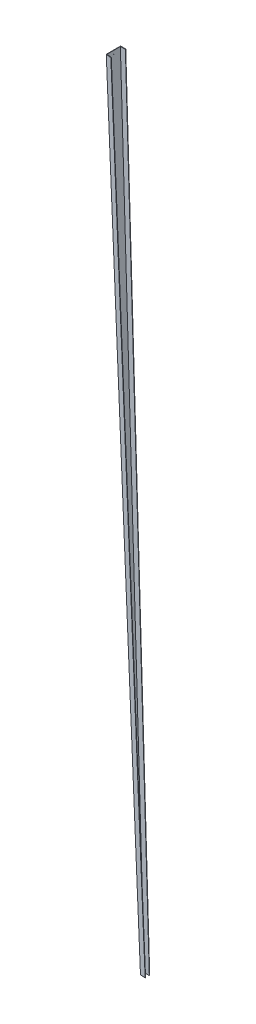
ISO-10303-21;
HEADER;
FILE_DESCRIPTION(('STEP AP214'),'2;1');
FILE_NAME('part.step','',(''),(''),'','','');
FILE_SCHEMA(('AUTOMOTIVE_DESIGN { 1 0 10303 214 1 1 1 1 }'));
ENDSEC;
DATA;
#1=APPLICATION_CONTEXT('core data for automotive mechanical design processes');
#2=APPLICATION_PROTOCOL_DEFINITION('international standard','automotive_design',2000,#1);
#3=PRODUCT_CONTEXT('',#1,'mechanical');
#4=PRODUCT('Part','Part','',(#3));
#5=PRODUCT_RELATED_PRODUCT_CATEGORY('part','',(#4));
#6=PRODUCT_DEFINITION_FORMATION('','',#4);
#7=PRODUCT_DEFINITION_CONTEXT('part definition',#1,'design');
#8=PRODUCT_DEFINITION('design','',#6,#7);
#9=PRODUCT_DEFINITION_SHAPE('','',#8);
#10=(LENGTH_UNIT() NAMED_UNIT(*) SI_UNIT(.MILLI.,.METRE.));
#11=(NAMED_UNIT(*) PLANE_ANGLE_UNIT() SI_UNIT($,.RADIAN.));
#12=(NAMED_UNIT(*) SI_UNIT($,.STERADIAN.) SOLID_ANGLE_UNIT());
#13=UNCERTAINTY_MEASURE_WITH_UNIT(LENGTH_MEASURE(1.E-05),#10,'distance_accuracy_value','');
#14=(GEOMETRIC_REPRESENTATION_CONTEXT(3) GLOBAL_UNCERTAINTY_ASSIGNED_CONTEXT((#13)) GLOBAL_UNIT_ASSIGNED_CONTEXT((#10,
#11,#12)) REPRESENTATION_CONTEXT('',''));
#15=CARTESIAN_POINT('',(0.,0.,0.));
#16=DIRECTION('',(0.,0.,1.));
#17=DIRECTION('',(1.,0.,0.));
#18=AXIS2_PLACEMENT_3D('',#15,#16,#17);
#19=CARTESIAN_POINT('',(602.457169605204,27.6347282334182,6.30826057862492E-12));
#20=DIRECTION('',(-0.998949627434447,-0.0458218490305554,0.));
#21=DIRECTION('',(0.0458218490305554,-0.998949627434447,0.));
#22=AXIS2_PLACEMENT_3D('',#19,#20,#21);
#23=PLANE('',#22);
#24=CARTESIAN_POINT('',(606.749301326457,-65.9368642395666,48.7060166163307));
#25=DIRECTION('',(0.998949627434447,0.0458218490305554,0.));
#26=DIRECTION('',(-0.0458218490305554,0.998949627434447,0.));
#27=AXIS2_PLACEMENT_3D('',#24,#25,#26);
#28=CIRCLE('',#27,1.99999999999999);
#29=CARTESIAN_POINT('',(606.657657628396,-63.9389649846978,48.7060166163307));
#30=VERTEX_POINT('',#29);
#31=EDGE_CURVE('E406',#30,#30,#28,.T.);
#32=ORIENTED_EDGE('',*,*,#31,.F.);
#33=EDGE_LOOP('',(#32));
#34=FACE_BOUND('',#33,.T.);
#35=CARTESIAN_POINT('',(606.749301326457,-65.9368642395666,8.70601661633069));
#36=DIRECTION('',(0.998949627434447,0.0458218490305554,0.));
#37=DIRECTION('',(-0.0458218490305554,0.998949627434447,0.));
#38=AXIS2_PLACEMENT_3D('',#35,#36,#37);
#39=CIRCLE('',#38,1.99999999999999);
#40=CARTESIAN_POINT('',(606.657657628396,-63.9389649846977,8.70601661633069));
#41=VERTEX_POINT('',#40);
#42=EDGE_CURVE('E390',#41,#41,#39,.T.);
#43=ORIENTED_EDGE('',*,*,#42,.F.);
#44=EDGE_LOOP('',(#43));
#45=FACE_BOUND('',#44,.T.);
#46=CARTESIAN_POINT('',(606.749301326458,-65.9368642395666,-31.2939833836693));
#47=DIRECTION('',(0.998949627434447,0.0458218490305554,0.));
#48=DIRECTION('',(-0.0458218490305554,0.998949627434447,0.));
#49=AXIS2_PLACEMENT_3D('',#46,#47,#48);
#50=CIRCLE('',#49,1.99999999999999);
#51=CARTESIAN_POINT('',(606.657657628396,-63.9389649846977,-31.2939833836693));
#52=VERTEX_POINT('',#51);
#53=EDGE_CURVE('E386',#52,#52,#50,.T.);
#54=ORIENTED_EDGE('',*,*,#53,.F.);
#55=EDGE_LOOP('',(#54));
#56=FACE_BOUND('',#55,.T.);
#57=DIRECTION('',(0.0458217623312295,-0.998947737326102,0.00194529892876554));
#58=VECTOR('',#57,1.);
#59=CARTESIAN_POINT('',(603.999995586582,-6.,178.649131077976));
#60=LINE('',#59,#58);
#61=CARTESIAN_POINT('',(603.999995586582,-6.,178.649131077976));
#62=VERTEX_POINT('',#61);
#63=CARTESIAN_POINT('',(1291.5,-14994.,207.835983657852));
#64=VERTEX_POINT('',#63);
#65=EDGE_CURVE('E234',#62,#64,#60,.T.);
#66=ORIENTED_EDGE('',*,*,#65,.T.);
#67=DIRECTION('',(0.,0.,1.));
#68=VECTOR('',#67,1.);
#69=CARTESIAN_POINT('',(1291.5,-14994.,1.35231497745026E-11));
#70=LINE('',#69,#68);
#71=CARTESIAN_POINT('',(1291.5,-14994.,144.218273573466));
#72=VERTEX_POINT('',#71);
#73=EDGE_CURVE('E197',#72,#64,#70,.T.);
#74=ORIENTED_EDGE('',*,*,#73,.F.);
#75=DIRECTION('',(0.0458166659402589,-0.998836632297189,0.0150404489071898));
#76=VECTOR('',#75,1.);
#77=CARTESIAN_POINT('',(603.999995586582,-6.,-81.4705337167815));
#78=LINE('',#77,#76);
#79=CARTESIAN_POINT('',(603.999995586583,-5.99999999999997,-81.4705337167815));
#80=VERTEX_POINT('',#79);
#81=EDGE_CURVE('E231',#80,#72,#78,.T.);
#82=ORIENTED_EDGE('',*,*,#81,.F.);
#83=DIRECTION('',(0.,0.,1.));
#84=VECTOR('',#83,1.);
#85=CARTESIAN_POINT('',(603.999995586584,-5.99999999999991,6.30826057862492E-12));
#86=LINE('',#85,#84);
#87=EDGE_CURVE('E525',#80,#62,#86,.T.);
#88=ORIENTED_EDGE('',*,*,#87,.T.);
#89=EDGE_LOOP('',(#66,#74,#82,#88));
#90=FACE_BOUND('',#89,.T.);
#91=CARTESIAN_POINT('',(606.749301326456,-65.9368642395666,128.706016616331));
#92=DIRECTION('',(0.998949627434447,0.0458218490305554,0.));
#93=DIRECTION('',(-0.0458218490305554,0.998949627434447,0.));
#94=AXIS2_PLACEMENT_3D('',#91,#92,#93);
#95=CIRCLE('',#94,1.99999999999997);
#96=CARTESIAN_POINT('',(606.657657628395,-63.9389649846977,128.706016616331));
#97=VERTEX_POINT('',#96);
#98=EDGE_CURVE('E393',#97,#97,#95,.T.);
#99=ORIENTED_EDGE('',*,*,#98,.F.);
#100=EDGE_LOOP('',(#99));
#101=FACE_BOUND('',#100,.T.);
#102=CARTESIAN_POINT('',(606.749301326456,-65.9368642395666,88.7060166163307));
#103=DIRECTION('',(0.998949627434447,0.0458218490305554,0.));
#104=DIRECTION('',(-0.0458218490305554,0.998949627434447,0.));
#105=AXIS2_PLACEMENT_3D('',#102,#103,#104);
#106=CIRCLE('',#105,1.99999999999999);
#107=CARTESIAN_POINT('',(606.657657628395,-63.9389649846977,88.7060166163307));
#108=VERTEX_POINT('',#107);
#109=EDGE_CURVE('E396',#108,#108,#106,.T.);
#110=ORIENTED_EDGE('',*,*,#109,.F.);
#111=EDGE_LOOP('',(#110));
#112=FACE_BOUND('',#111,.T.);
#113=ADVANCED_FACE('F83',(#34,#45,#56,#90,#101,#112),#23,.F.);
#114=CARTESIAN_POINT('',(600.,-6.,-89.4645917201508));
#115=CARTESIAN_POINT('',(602.959954579327,-6.,-89.4845653543023));
#116=CARTESIAN_POINT('',(672.159470052555,-6.,-89.915884825626));
#117=CARTESIAN_POINT('',(807.50010751329,-6.,-89.1942007030712));
#118=CARTESIAN_POINT('',(1005.86522896463,-6.,-85.7827057176364));
#119=CARTESIAN_POINT('',(1269.9834249324,-6.,-79.4685170125723));
#120=CARTESIAN_POINT('',(1600.82582994271,-6.,-70.8683714694671));
#121=CARTESIAN_POINT('',(1998.59898384505,-6.,-59.7433814067206));
#122=CARTESIAN_POINT('',(2331.90774460236,-6.,-48.6742990694277));
#123=CARTESIAN_POINT('',(2532.42608256137,-6.,-42.1441188913942));
#124=CARTESIAN_POINT('',(2599.99999999987,-6.,-39.9640819582946));
#125=B_SPLINE_CURVE_WITH_KNOTS('',3,(#114,#115,#116,#117,#118,#119,#120,#121,#122,#123,#124),
.UNSPECIFIED.,.F.,.F.,(4,1,1,1,1,1,1,1,4),(0.579110380304753,0.580209466371041,
0.604805069213507,0.629344388861473,0.653862178346251,0.702881350286838,0.752206113639191,
0.801585908260931,0.826684648113737),.UNSPECIFIED.);
#126=DIRECTION('',(0.,1.,0.));
#127=VECTOR('',#126,1.);
#128=SURFACE_OF_LINEAR_EXTRUSION('',#125,#127);
#129=CARTESIAN_POINT('',(600.,0.,-89.4645917201508));
#130=CARTESIAN_POINT('',(602.959954579327,0.,-89.4845653543023));
#131=CARTESIAN_POINT('',(672.159470052555,0.,-89.915884825626));
#132=CARTESIAN_POINT('',(807.50010751329,0.,-89.1942007030712));
#133=CARTESIAN_POINT('',(1005.86522896463,0.,-85.7827057176364));
#134=CARTESIAN_POINT('',(1269.9834249324,0.,-79.4685170125723));
#135=CARTESIAN_POINT('',(1600.82582994271,0.,-70.8683714694671));
#136=CARTESIAN_POINT('',(1998.59898384505,0.,-59.7433814067206));
#137=CARTESIAN_POINT('',(2331.90774460236,0.,-48.6742990694277));
#138=CARTESIAN_POINT('',(2532.42608256137,0.,-42.1441188913942));
#139=CARTESIAN_POINT('',(2599.99999999987,0.,-39.9640819582946));
#140=B_SPLINE_CURVE_WITH_KNOTS('',3,(#129,#130,#131,#132,#133,#134,#135,#136,#137,#138,#139),
.UNSPECIFIED.,.F.,.F.,(4,1,1,1,1,1,1,1,4),(0.579110380304753,0.580209466371041,
0.604805069213507,0.629344388861473,0.653862178346251,0.702881350286838,0.752206113639191,
0.801585908260931,0.826684648113737),.UNSPECIFIED.);
#141=CARTESIAN_POINT('',(600.,0.,-89.4645917201508));
#142=VERTEX_POINT('',#141);
#143=CARTESIAN_POINT('',(700.,0.,-89.6130576844665));
#144=VERTEX_POINT('',#143);
#145=EDGE_CURVE('E299',#142,#144,#140,.T.);
#146=ORIENTED_EDGE('',*,*,#145,.T.);
#147=DIRECTION('',(0.,1.,0.));
#148=VECTOR('',#147,1.);
#149=CARTESIAN_POINT('',(700.,-6.,-89.6130576844665));
#150=LINE('',#149,#148);
#151=CARTESIAN_POINT('',(700.,-6.,-89.6130576844665));
#152=VERTEX_POINT('',#151);
#153=EDGE_CURVE('E12',#152,#144,#150,.T.);
#154=ORIENTED_EDGE('',*,*,#153,.F.);
#155=CARTESIAN_POINT('',(600.,-6.,-89.4645917201508));
#156=CARTESIAN_POINT('',(602.959954579327,-6.,-89.4845653543023));
#157=CARTESIAN_POINT('',(619.624334203692,-6.,-89.5884341655268));
#158=CARTESIAN_POINT('',(636.290291408736,-6.,-89.6458822146248));
#159=CARTESIAN_POINT('',(666.663572408395,-6.,-89.687677717433));
#160=CARTESIAN_POINT('',(683.331529465492,-6.,-89.6686443909208));
#161=CARTESIAN_POINT('',(700.,-6.,-89.6130576844665));
#162=B_SPLINE_CURVE_WITH_KNOTS('',3,(#155,#156,#157,#158,#159,#160,#161),.UNSPECIFIED.,.F.,.F.,
(4,1,2,4),(0.,0.0888121217356998,0.5,1.),.UNSPECIFIED.);
#163=CARTESIAN_POINT('',(600.,-6.,-89.4645917201508));
#164=VERTEX_POINT('',#163);
#165=EDGE_CURVE('E161',#164,#152,#162,.T.);
#166=ORIENTED_EDGE('',*,*,#165,.F.);
#167=DIRECTION('',(0.,1.,0.));
#168=VECTOR('',#167,1.);
#169=CARTESIAN_POINT('',(600.,-6.,-89.4645917201508));
#170=LINE('',#169,#168);
#171=EDGE_CURVE('E838',#164,#142,#170,.T.);
#172=ORIENTED_EDGE('',*,*,#171,.T.);
#173=EDGE_LOOP('',(#146,#154,#166,#172));
#174=FACE_BOUND('',#173,.T.);
#175=ADVANCED_FACE('F85',(#174),#128,.F.);
#176=CARTESIAN_POINT('',(699.693373253527,-6.,2.33336646375407));
#177=DIRECTION('',(-0.99999443946263,0.,-0.0033348229069724));
#178=DIRECTION('',(-0.0033348229069724,0.,0.99999443946263));
#179=AXIS2_PLACEMENT_3D('',#176,#177,#178);
#180=PLANE('',#179);
#181=DIRECTION('',(-0.0033348229069724,0.,0.99999443946263));
#182=VECTOR('',#181,1.);
#183=CARTESIAN_POINT('',(699.693373253527,0.,2.33336646375407));
#184=LINE('',#183,#182);
#185=CARTESIAN_POINT('',(699.973321416744,0.,-81.6131021687654));
#186=VERTEX_POINT('',#185);
#187=EDGE_CURVE('E908',#144,#186,#184,.T.);
#188=ORIENTED_EDGE('',*,*,#187,.T.);
#189=DIRECTION('',(0.,1.,0.));
#190=VECTOR('',#189,1.);
#191=CARTESIAN_POINT('',(699.973321416744,-6.,-81.6131021687654));
#192=LINE('',#191,#190);
#193=CARTESIAN_POINT('',(699.973321416747,-6.00000000013778,-81.6131021687644));
#194=VERTEX_POINT('',#193);
#195=EDGE_CURVE('E95',#194,#186,#192,.T.);
#196=ORIENTED_EDGE('',*,*,#195,.F.);
#197=DIRECTION('',(-0.0033348229069724,0.,0.99999443946263));
#198=VECTOR('',#197,1.);
#199=CARTESIAN_POINT('',(699.693373253527,-6.,2.33336646375407));
#200=LINE('',#199,#198);
#201=EDGE_CURVE('E153',#152,#194,#200,.T.);
#202=ORIENTED_EDGE('',*,*,#201,.F.);
#203=ORIENTED_EDGE('',*,*,#153,.T.);
#204=EDGE_LOOP('',(#188,#196,#202,#203));
#205=FACE_BOUND('',#204,.T.);
#206=ADVANCED_FACE('F510',(#205),#180,.F.);
#207=CARTESIAN_POINT('',(-0.119691424209446,-6.,-80.5731134404165));
#208=DIRECTION('',(0.00148549915767978,0.,0.999998896645518));
#209=DIRECTION('',(0.999998896645518,0.,-0.00148549915767978));
#210=AXIS2_PLACEMENT_3D('',#207,#208,#209);
#211=PLANE('',#210);
#212=DIRECTION('',(0.999998896645518,0.,-0.00148549915767978));
#213=VECTOR('',#212,1.);
#214=CARTESIAN_POINT('',(-0.119691424209446,0.,-80.5731134404165));
#215=LINE('',#214,#213);
#216=CARTESIAN_POINT('',(603.999995586582,0.,-81.4705337167815));
#217=VERTEX_POINT('',#216);
#218=EDGE_CURVE('E905',#217,#186,#215,.T.);
#219=ORIENTED_EDGE('',*,*,#218,.F.);
#220=DIRECTION('',(0.,1.,0.));
#221=VECTOR('',#220,1.);
#222=CARTESIAN_POINT('',(603.999995586582,-6.,-81.4705337167815));
#223=LINE('',#222,#221);
#224=EDGE_CURVE('E932',#80,#217,#223,.T.);
#225=ORIENTED_EDGE('',*,*,#224,.F.);
#226=DIRECTION('',(0.999998896645518,0.,-0.00148549915767978));
#227=VECTOR('',#226,1.);
#228=CARTESIAN_POINT('',(-0.119691424209446,-6.,-80.5731134404165));
#229=LINE('',#228,#227);
#230=EDGE_CURVE('E145',#80,#194,#229,.T.);
#231=ORIENTED_EDGE('',*,*,#230,.T.);
#232=ORIENTED_EDGE('',*,*,#195,.T.);
#233=EDGE_LOOP('',(#219,#225,#231,#232));
#234=FACE_BOUND('',#233,.T.);
#235=ADVANCED_FACE('F955',(#234),#211,.T.);
#236=CARTESIAN_POINT('',(603.999995586582,-6.,0.));
#237=DIRECTION('',(-1.,0.,0.));
#238=DIRECTION('',(0.,0.,1.));
#239=AXIS2_PLACEMENT_3D('',#236,#237,#238);
#240=PLANE('',#239);
#241=DIRECTION('',(0.,0.,1.));
#242=VECTOR('',#241,1.);
#243=CARTESIAN_POINT('',(603.999995586582,0.,0.));
#244=LINE('',#243,#242);
#245=CARTESIAN_POINT('',(603.999995586582,0.,178.649131077976));
#246=VERTEX_POINT('',#245);
#247=EDGE_CURVE('E903',#217,#246,#244,.T.);
#248=ORIENTED_EDGE('',*,*,#247,.T.);
#249=DIRECTION('',(0.,1.,0.));
#250=VECTOR('',#249,1.);
#251=CARTESIAN_POINT('',(603.999995586582,-6.,178.649131077976));
#252=LINE('',#251,#250);
#253=EDGE_CURVE('E934',#62,#246,#252,.T.);
#254=ORIENTED_EDGE('',*,*,#253,.F.);
#255=ORIENTED_EDGE('',*,*,#87,.F.);
#256=ORIENTED_EDGE('',*,*,#224,.T.);
#257=EDGE_LOOP('',(#248,#254,#255,#256));
#258=FACE_BOUND('',#257,.T.);
#259=ADVANCED_FACE('F970',(#258),#240,.F.);
#260=CARTESIAN_POINT('',(-12.4360773083858,-6.,107.011604593883));
#261=DIRECTION('',(-0.115435534804312,0.,0.993314973865008));
#262=DIRECTION('',(0.993314973865009,0.,0.115435534804312));
#263=AXIS2_PLACEMENT_3D('',#260,#261,#262);
#264=PLANE('',#263);
#265=DIRECTION('',(0.993314973865009,0.,0.115435534804312));
#266=VECTOR('',#265,1.);
#267=CARTESIAN_POINT('',(-12.4360773083858,0.,107.011604593883));
#268=LINE('',#267,#266);
#269=CARTESIAN_POINT('',(700.169555672472,0.,189.825228179597));
#270=VERTEX_POINT('',#269);
#271=EDGE_CURVE('E900',#246,#270,#268,.T.);
#272=ORIENTED_EDGE('',*,*,#271,.T.);
#273=DIRECTION('',(0.,1.,0.));
#274=VECTOR('',#273,1.);
#275=CARTESIAN_POINT('',(700.169555672472,-6.,189.825228179597));
#276=LINE('',#275,#274);
#277=CARTESIAN_POINT('',(700.169555672472,-6.00000000001838,189.825228179598));
#278=VERTEX_POINT('',#277);
#279=EDGE_CURVE('E937',#278,#270,#276,.T.);
#280=ORIENTED_EDGE('',*,*,#279,.F.);
#281=DIRECTION('',(0.993314973865009,0.,0.115435534804312));
#282=VECTOR('',#281,1.);
#283=CARTESIAN_POINT('',(-12.4360773083858,-6.,107.011604593883));
#284=LINE('',#283,#282);
#285=EDGE_CURVE('E230',#62,#278,#284,.T.);
#286=ORIENTED_EDGE('',*,*,#285,.F.);
#287=ORIENTED_EDGE('',*,*,#253,.T.);
#288=EDGE_LOOP('',(#272,#280,#286,#287));
#289=FACE_BOUND('',#288,.T.);
#290=ADVANCED_FACE('F949',(#289),#264,.F.);
#291=CARTESIAN_POINT('',(712.292264494189,-6.,75.5866575821689));
#292=DIRECTION('',(0.994416651818414,0.,0.105524985601775));
#293=DIRECTION('',(0.105524985601775,0.,-0.994416651818414));
#294=AXIS2_PLACEMENT_3D('',#291,#292,#293);
#295=PLANE('',#294);
#296=DIRECTION('',(0.105524985601775,0.,-0.994416651818414));
#297=VECTOR('',#296,1.);
#298=CARTESIAN_POINT('',(712.292264494189,0.,75.5866575821689));
#299=LINE('',#298,#297);
#300=CARTESIAN_POINT('',(699.325355787658,0.,197.780561394145));
#301=VERTEX_POINT('',#300);
#302=EDGE_CURVE('E894',#301,#270,#299,.T.);
#303=ORIENTED_EDGE('',*,*,#302,.F.);
#304=DIRECTION('',(0.,1.,0.));
#305=VECTOR('',#304,1.);
#306=CARTESIAN_POINT('',(699.325355787658,-6.,197.780561394145));
#307=LINE('',#306,#305);
#308=CARTESIAN_POINT('',(699.325355787658,-6.,197.780561394145));
#309=VERTEX_POINT('',#308);
#310=EDGE_CURVE('E913',#309,#301,#307,.T.);
#311=ORIENTED_EDGE('',*,*,#310,.F.);
#312=DIRECTION('',(0.105524985601775,0.,-0.994416651818414));
#313=VECTOR('',#312,1.);
#314=CARTESIAN_POINT('',(712.292264494189,-6.,75.5866575821689));
#315=LINE('',#314,#313);
#316=EDGE_CURVE('E842',#309,#278,#315,.T.);
#317=ORIENTED_EDGE('',*,*,#316,.T.);
#318=ORIENTED_EDGE('',*,*,#279,.T.);
#319=EDGE_LOOP('',(#303,#311,#317,#318));
#320=FACE_BOUND('',#319,.T.);
#321=ADVANCED_FACE('F866',(#320),#295,.T.);
#322=CARTESIAN_POINT('',(2599.99999999987,-6.,170.586846022276));
#323=CARTESIAN_POINT('',(2534.26970415841,-6.,176.346832185852));
#324=CARTESIAN_POINT('',(2334.95316219608,-6.,192.748822912609));
#325=CARTESIAN_POINT('',(2001.69070185449,-6.,214.463612082598));
#326=CARTESIAN_POINT('',(1599.37094291801,-6.,231.35256071879));
#327=CARTESIAN_POINT('',(1263.24435450254,-6.,232.556224403624));
#328=CARTESIAN_POINT('',(993.973907448511,-6.,222.123757286777));
#329=CARTESIAN_POINT('',(795.174235255832,-6.,208.219874455327));
#330=CARTESIAN_POINT('',(663.965855096807,-6.,194.360823911171));
#331=CARTESIAN_POINT('',(600.,-6.,186.18428191945));
#332=B_SPLINE_CURVE_WITH_KNOTS('',3,(#322,#323,#324,#325,#326,#327,#328,#329,#330,#331),
.UNSPECIFIED.,.F.,.F.,(4,1,1,1,1,1,1,4),(0.174597883745963,0.199092181037773,0.248838608700846,
0.298568063520415,0.348560819140765,0.373566506187247,0.398590699494546,0.422530238981496),.UNSPECIFIED.);
#333=DIRECTION('',(0.,1.,0.));
#334=VECTOR('',#333,1.);
#335=SURFACE_OF_LINEAR_EXTRUSION('',#332,#334);
#336=CARTESIAN_POINT('',(2599.99999999987,0.,170.586846022276));
#337=CARTESIAN_POINT('',(2534.26970415841,0.,176.346832185852));
#338=CARTESIAN_POINT('',(2334.95316219608,0.,192.748822912609));
#339=CARTESIAN_POINT('',(2001.69070185449,0.,214.463612082598));
#340=CARTESIAN_POINT('',(1599.37094291801,0.,231.35256071879));
#341=CARTESIAN_POINT('',(1263.24435450254,0.,232.556224403624));
#342=CARTESIAN_POINT('',(993.973907448511,0.,222.123757286777));
#343=CARTESIAN_POINT('',(795.174235255832,0.,208.219874455327));
#344=CARTESIAN_POINT('',(663.965855096807,0.,194.360823911171));
#345=CARTESIAN_POINT('',(600.,0.,186.18428191945));
#346=B_SPLINE_CURVE_WITH_KNOTS('',3,(#336,#337,#338,#339,#340,#341,#342,#343,#344,#345),
.UNSPECIFIED.,.F.,.F.,(4,1,1,1,1,1,1,4),(0.174597883745963,0.199092181037773,0.248838608700846,
0.298568063520415,0.348560819140765,0.373566506187247,0.398590699494546,0.422530238981496),.UNSPECIFIED.);
#347=CARTESIAN_POINT('',(600.,0.,186.18428191945));
#348=VERTEX_POINT('',#347);
#349=EDGE_CURVE('E889',#301,#348,#346,.T.);
#350=ORIENTED_EDGE('',*,*,#349,.T.);
#351=DIRECTION('',(0.,1.,0.));
#352=VECTOR('',#351,1.);
#353=CARTESIAN_POINT('',(600.,-6.,186.18428191945));
#354=LINE('',#353,#352);
#355=CARTESIAN_POINT('',(600.,-6.,186.18428191945));
#356=VERTEX_POINT('',#355);
#357=EDGE_CURVE('E911',#356,#348,#354,.T.);
#358=ORIENTED_EDGE('',*,*,#357,.F.);
#359=CARTESIAN_POINT('',(699.325355787657,-6.,197.780561394145));
#360=CARTESIAN_POINT('',(682.750677507029,-6.,196.021698362518));
#361=CARTESIAN_POINT('',(666.185158089687,-6.,194.179220645661));
#362=CARTESIAN_POINT('',(633.075638865744,-6.,190.317104575944));
#363=CARTESIAN_POINT('',(616.531639059144,-6.,188.297466223084));
#364=CARTESIAN_POINT('',(600.,-6.,186.18428191945));
#365=B_SPLINE_CURVE_WITH_KNOTS('',3,(#359,#360,#361,#362,#363,#364),.UNSPECIFIED.,.F.,.F.,(4,2,
4),(0.,0.5,1.),.UNSPECIFIED.);
#366=EDGE_CURVE('E247',#309,#356,#365,.T.);
#367=ORIENTED_EDGE('',*,*,#366,.F.);
#368=ORIENTED_EDGE('',*,*,#310,.T.);
#369=EDGE_LOOP('',(#350,#358,#367,#368));
#370=FACE_BOUND('',#369,.T.);
#371=ADVANCED_FACE('F855',(#370),#335,.F.);
#372=CARTESIAN_POINT('',(600.,-6.,0.));
#373=DIRECTION('',(-1.,0.,0.));
#374=DIRECTION('',(0.,0.,1.));
#375=AXIS2_PLACEMENT_3D('',#372,#373,#374);
#376=PLANE('',#375);
#377=DIRECTION('',(0.,0.,1.));
#378=VECTOR('',#377,1.);
#379=CARTESIAN_POINT('',(600.,0.,0.));
#380=LINE('',#379,#378);
#381=EDGE_CURVE('E883',#142,#348,#380,.T.);
#382=ORIENTED_EDGE('',*,*,#381,.F.);
#383=ORIENTED_EDGE('',*,*,#171,.F.);
#384=DIRECTION('',(0.,0.,1.));
#385=VECTOR('',#384,1.);
#386=CARTESIAN_POINT('',(600.,-6.,0.));
#387=LINE('',#386,#385);
#388=EDGE_CURVE('E755',#164,#356,#387,.T.);
#389=ORIENTED_EDGE('',*,*,#388,.T.);
#390=ORIENTED_EDGE('',*,*,#357,.T.);
#391=EDGE_LOOP('',(#382,#383,#389,#390));
#392=FACE_BOUND('',#391,.T.);
#393=ADVANCED_FACE('F865',(#392),#376,.T.);
#394=CARTESIAN_POINT('',(0.,0.,0.));
#395=DIRECTION('',(0.,1.,0.));
#396=DIRECTION('',(0.,0.,1.));
#397=AXIS2_PLACEMENT_3D('',#394,#395,#396);
#398=PLANE('',#397);
#399=ORIENTED_EDGE('',*,*,#145,.F.);
#400=ORIENTED_EDGE('',*,*,#381,.T.);
#401=ORIENTED_EDGE('',*,*,#349,.F.);
#402=ORIENTED_EDGE('',*,*,#302,.T.);
#403=ORIENTED_EDGE('',*,*,#271,.F.);
#404=ORIENTED_EDGE('',*,*,#247,.F.);
#405=ORIENTED_EDGE('',*,*,#218,.T.);
#406=ORIENTED_EDGE('',*,*,#187,.F.);
#407=EDGE_LOOP('',(#399,#400,#401,#402,#403,#404,#405,#406));
#408=FACE_BOUND('',#407,.T.);
#409=ADVANCED_FACE('F597',(#408),#398,.T.);
#410=CARTESIAN_POINT('',(699.973321416744,-6.,-81.6131021687655));
#411=CARTESIAN_POINT('',(1387.36019350182,-14994.,144.900282567612));
#412=CARTESIAN_POINT('',(683.977767111713,-6.,-81.5893407601015));
#413=CARTESIAN_POINT('',(1371.38349458484,-14994.,144.786614401921));
#414=CARTESIAN_POINT('',(667.982212806683,-6.,-81.5655793514374));
#415=CARTESIAN_POINT('',(1355.40679566786,-14994.,144.67294623623));
#416=CARTESIAN_POINT('',(635.991104196629,-6.,-81.5180565341095));
#417=CARTESIAN_POINT('',(1323.45339783392,-14994.,144.445609904848));
#418=CARTESIAN_POINT('',(619.995549891605,-6.,-81.4942951254455));
#419=CARTESIAN_POINT('',(1307.47669891696,-14994.,144.331941739157));
#420=CARTESIAN_POINT('',(603.999995586582,-6.,-81.4705337167815));
#421=CARTESIAN_POINT('',(1291.5,-14994.,144.218273573466));
#422=B_SPLINE_SURFACE_WITH_KNOTS('',3,1,((#410,#411),(#412,#413),(#414,#415),(#416,#417),(#418,
#419),(#420,#421)),.UNSPECIFIED.,.F.,.F.,.F.,(4,2,4),(2,2),(0.,0.5,1.),(0.,1.),.UNSPECIFIED.);
#423=DIRECTION('',(0.999974692041193,0.,0.00711444144829202));
#424=VECTOR('',#423,1.);
#425=CARTESIAN_POINT('',(-0.960636865922877,-14994.,135.022905332261));
#426=LINE('',#425,#424);
#427=CARTESIAN_POINT('',(1387.36019350182,-14994.,144.900282567612));
#428=VERTEX_POINT('',#427);
#429=EDGE_CURVE('E324',#72,#428,#426,.T.);
#430=DIRECTION('',(0.0458091044199773,-0.998836150251133,0.0150953934607978));
#431=VECTOR('',#430,1.);
#432=CARTESIAN_POINT('',(1043.66675745928,-7500.,31.6435901994234));
#433=LINE('',#432,#431);
#434=EDGE_CURVE('E533',#194,#428,#433,.T.);
#435=ORIENTED_EDGE('',*,*,#230,.F.);
#436=ORIENTED_EDGE('',*,*,#81,.T.);
#437=ORIENTED_EDGE('',*,*,#429,.T.);
#438=ORIENTED_EDGE('',*,*,#434,.F.);
#439=EDGE_LOOP('',(#435,#436,#437,#438));
#440=FACE_BOUND('',#439,.T.);
#441=ADVANCED_FACE('F587',(#440),#422,.T.);
#442=CARTESIAN_POINT('',(603.999995586582,-6.,178.649131077976));
#443=CARTESIAN_POINT('',(1291.5,-14994.,207.835983657852));
#444=CARTESIAN_POINT('',(620.028255600897,-6.,180.511813928246));
#445=CARTESIAN_POINT('',(1307.51271827648,-14994.,209.360776973726));
#446=CARTESIAN_POINT('',(636.056515615212,-6.,182.374496778516));
#447=CARTESIAN_POINT('',(1323.52543655297,-14994.,210.885570289601));
#448=CARTESIAN_POINT('',(668.113035643842,-6.,186.099862479057));
#449=CARTESIAN_POINT('',(1355.55087310593,-14994.,213.935156921349));
#450=CARTESIAN_POINT('',(684.141295658157,-6.,187.962545329327));
#451=CARTESIAN_POINT('',(1371.56359138241,-14994.,215.459950237224));
#452=CARTESIAN_POINT('',(700.169555672472,-6.,189.825228179597));
#453=CARTESIAN_POINT('',(1387.5763096589,-14994.,216.984743553098));
#454=B_SPLINE_SURFACE_WITH_KNOTS('',3,1,((#442,#443),(#444,#445),(#446,#447),(#448,#449),(#450,
#451),(#452,#453)),.UNSPECIFIED.,.F.,.F.,.F.,(4,2,4),(2,2),(0.,0.5,1.),(0.,1.),.UNSPECIFIED.);
#455=DIRECTION('',(0.0458155718769109,-0.998948275251744,0.00181017821183824));
#456=VECTOR('',#455,1.);
#457=CARTESIAN_POINT('',(1043.87293266569,-7500.,203.404985866348));
#458=LINE('',#457,#456);
#459=CARTESIAN_POINT('',(1387.5763096589,-14994.,216.984743553098));
#460=VERTEX_POINT('',#459);
#461=EDGE_CURVE('E220',#278,#460,#458,.T.);
#462=DIRECTION('',(0.995496807223163,0.,0.0947950779760733));
#463=VECTOR('',#462,1.);
#464=CARTESIAN_POINT('',(-8.00755020312755,-14994.,84.0918202831659));
#465=LINE('',#464,#463);
#466=EDGE_CURVE('E180',#64,#460,#465,.T.);
#467=ORIENTED_EDGE('',*,*,#285,.T.);
#468=ORIENTED_EDGE('',*,*,#461,.T.);
#469=ORIENTED_EDGE('',*,*,#466,.F.);
#470=ORIENTED_EDGE('',*,*,#65,.F.);
#471=EDGE_LOOP('',(#467,#468,#469,#470));
#472=FACE_BOUND('',#471,.T.);
#473=ADVANCED_FACE('F228',(#472),#454,.T.);
#474=CARTESIAN_POINT('',(700.169555672472,-6.,189.825228179598));
#475=CARTESIAN_POINT('',(1387.5763096589,-14994.,216.984743553098));
#476=CARTESIAN_POINT('',(700.028855691669,-6.,191.151117048689));
#477=CARTESIAN_POINT('',(1387.48835082466,-14994.,218.310166279179));
#478=CARTESIAN_POINT('',(699.888155710867,-6.,192.47700591778));
#479=CARTESIAN_POINT('',(1387.40039199042,-14994.,219.63558900526));
#480=CARTESIAN_POINT('',(699.606755749262,-6.,195.128783655962));
#481=CARTESIAN_POINT('',(1387.22447432195,-14994.,222.286434457423));
#482=CARTESIAN_POINT('',(699.46605576846,-6.,196.454672525053));
#483=CARTESIAN_POINT('',(1387.13651548771,-14994.,223.611857183504));
#484=CARTESIAN_POINT('',(699.325355787658,-6.,197.780561394145));
#485=CARTESIAN_POINT('',(1387.04855665347,-14994.,224.937279909585));
#486=B_SPLINE_SURFACE_WITH_KNOTS('',3,1,((#474,#475),(#476,#477),(#478,#479),(#480,#481),(#482,
#483),(#484,#485)),.UNSPECIFIED.,.F.,.F.,.F.,(4,2,4),(2,2),(0.,0.5,1.),(0.,1.),.UNSPECIFIED.);
#487=DIRECTION('',(0.045836618734023,-0.998947310081488,0.00180999005281817));
#488=VECTOR('',#487,1.);
#489=CARTESIAN_POINT('',(1043.18695622057,-7500.,211.358920651865));
#490=LINE('',#489,#488);
#491=CARTESIAN_POINT('',(1387.04855665347,-14994.,224.937279909585));
#492=VERTEX_POINT('',#491);
#493=EDGE_CURVE('E223',#309,#492,#490,.T.);
#494=DIRECTION('',(0.0662172024997742,0.,-0.99780523254446));
#495=VECTOR('',#494,1.);
#496=CARTESIAN_POINT('',(1395.82876698186,-14994.,92.6311800175189));
#497=LINE('',#496,#495);
#498=EDGE_CURVE('E198',#492,#460,#497,.T.);
#499=ORIENTED_EDGE('',*,*,#316,.F.);
#500=ORIENTED_EDGE('',*,*,#493,.T.);
#501=ORIENTED_EDGE('',*,*,#498,.T.);
#502=ORIENTED_EDGE('',*,*,#461,.F.);
#503=EDGE_LOOP('',(#499,#500,#501,#502));
#504=FACE_BOUND('',#503,.T.);
#505=ADVANCED_FACE('F219',(#504),#486,.T.);
#506=CARTESIAN_POINT('',(699.325355787657,-6.,197.780561394145));
#507=CARTESIAN_POINT('',(1387.04855665347,-14994.,224.937279909585));
#508=CARTESIAN_POINT('',(682.750677507029,-6.,196.021698362518));
#509=CARTESIAN_POINT('',(1370.41657148864,-14994.,223.833533914162));
#510=CARTESIAN_POINT('',(666.185158089687,-6.,194.179220645661));
#511=CARTESIAN_POINT('',(1353.79854259274,-14994.,222.513393852363));
#512=CARTESIAN_POINT('',(633.075638865744,-6.,190.317104575944));
#513=CARTESIAN_POINT('',(1320.60632603142,-14994.,219.382492045922));
#514=CARTESIAN_POINT('',(616.531639059144,-6.,188.297466223084));
#515=CARTESIAN_POINT('',(1304.03338165018,-14994.,217.568495149776));
#516=CARTESIAN_POINT('',(600.,-6.,186.18428191945));
#517=CARTESIAN_POINT('',(1287.5,-14994.,215.455088099822));
#518=B_SPLINE_SURFACE_WITH_KNOTS('',3,1,((#506,#507),(#508,#509),(#510,#511),(#512,#513),(#514,
#515),(#516,#517)),.UNSPECIFIED.,.F.,.F.,.F.,(4,2,4),(2,2),(0.,0.5,1.),(0.,1.),.UNSPECIFIED.);
#519=DIRECTION('',(0.0458217615382106,-0.998947726450474,0.00195089440120463));
#520=VECTOR('',#519,1.);
#521=CARTESIAN_POINT('',(943.75,-7500.,200.819685009636));
#522=LINE('',#521,#520);
#523=CARTESIAN_POINT('',(1287.5,-14994.,215.455088099822));
#524=VERTEX_POINT('',#523);
#525=EDGE_CURVE('E104',#356,#524,#522,.T.);
#526=CARTESIAN_POINT('',(1600.,-14994.,228.759999939174));
#527=CARTESIAN_POINT('',(1557.92377523061,-14994.,229.720145477379));
#528=CARTESIAN_POINT('',(1494.76386078482,-14994.,229.946320085692));
#529=CARTESIAN_POINT('',(1410.61684608082,-14994.,226.686174128153));
#530=CARTESIAN_POINT('',(1348.49194851927,-14994.,222.341210755425));
#531=CARTESIAN_POINT('',(1307.48932971841,-14994.,218.010257468351));
#532=CARTESIAN_POINT('',(1287.5,-14994.,215.455088099822));
#533=(BOUNDED_CURVE() B_SPLINE_CURVE(3,(#526,#527,#528,#529,#530,#531,#532),.UNSPECIFIED.,.F.,
.F.) B_SPLINE_CURVE_WITH_KNOTS((4,1,1,1,4),(0.298568063520415,0.348560819140765,
0.373566506187247,0.398590699494547,0.422530238981496),
.UNSPECIFIED.) CURVE() GEOMETRIC_REPRESENTATION_ITEM() RATIONAL_B_SPLINE_CURVE((1.,1.,1.,1.,1.,
1.,1.)) REPRESENTATION_ITEM(''));
#534=EDGE_CURVE('E224',#492,#524,#533,.T.);
#535=ORIENTED_EDGE('',*,*,#366,.T.);
#536=ORIENTED_EDGE('',*,*,#525,.T.);
#537=ORIENTED_EDGE('',*,*,#534,.F.);
#538=ORIENTED_EDGE('',*,*,#493,.F.);
#539=EDGE_LOOP('',(#535,#536,#537,#538));
#540=FACE_BOUND('',#539,.T.);
#541=ADVANCED_FACE('F254',(#540),#518,.T.);
#542=CARTESIAN_POINT('',(598.465572594644,27.4516333839617,1.48866459647289E-12));
#543=DIRECTION('',(-0.998949627447912,-0.0458218487370189,0.));
#544=DIRECTION('',(0.0458218487370189,-0.998949627447912,0.));
#545=AXIS2_PLACEMENT_3D('',#542,#543,#544);
#546=PLANE('',#545);
#547=CARTESIAN_POINT('',(602.757704280335,-66.1199589144282,48.7060166163307));
#548=DIRECTION('',(-0.998949627447912,-0.0458218487370189,0.));
#549=DIRECTION('',(0.0458218487370189,-0.998949627447912,0.));
#550=AXIS2_PLACEMENT_3D('',#547,#548,#549);
#551=CIRCLE('',#550,1.99999999999995);
#552=CARTESIAN_POINT('',(602.849347977809,-68.117858169324,48.7060166163307));
#553=VERTEX_POINT('',#552);
#554=EDGE_CURVE('E89',#553,#553,#551,.T.);
#555=ORIENTED_EDGE('',*,*,#554,.F.);
#556=EDGE_LOOP('',(#555));
#557=FACE_BOUND('',#556,.T.);
#558=CARTESIAN_POINT('',(602.757704280335,-66.1199589144282,88.7060166163307));
#559=DIRECTION('',(-0.998949627447912,-0.0458218487370189,0.));
#560=DIRECTION('',(0.0458218487370189,-0.998949627447912,0.));
#561=AXIS2_PLACEMENT_3D('',#558,#559,#560);
#562=CIRCLE('',#561,1.99999999999995);
#563=CARTESIAN_POINT('',(602.849347977809,-68.117858169324,88.7060166163307));
#564=VERTEX_POINT('',#563);
#565=EDGE_CURVE('E394',#564,#564,#562,.T.);
#566=ORIENTED_EDGE('',*,*,#565,.F.);
#567=EDGE_LOOP('',(#566));
#568=FACE_BOUND('',#567,.T.);
#569=CARTESIAN_POINT('',(602.757704280335,-66.1199589144282,128.706016616331));
#570=DIRECTION('',(-0.998949627447912,-0.0458218487370189,0.));
#571=DIRECTION('',(0.0458218487370189,-0.998949627447912,0.));
#572=AXIS2_PLACEMENT_3D('',#569,#570,#571);
#573=CIRCLE('',#572,1.99999999999993);
#574=CARTESIAN_POINT('',(602.849347977809,-68.1178581693239,128.706016616331));
#575=VERTEX_POINT('',#574);
#576=EDGE_CURVE('E391',#575,#575,#573,.T.);
#577=ORIENTED_EDGE('',*,*,#576,.F.);
#578=EDGE_LOOP('',(#577));
#579=FACE_BOUND('',#578,.T.);
#580=CARTESIAN_POINT('',(602.757704280335,-66.1199589144282,8.70601661633069));
#581=DIRECTION('',(-0.998949627447912,-0.0458218487370189,0.));
#582=DIRECTION('',(0.0458218487370189,-0.998949627447912,0.));
#583=AXIS2_PLACEMENT_3D('',#580,#581,#582);
#584=CIRCLE('',#583,1.99999999999995);
#585=CARTESIAN_POINT('',(602.849347977809,-68.117858169324,8.70601661633069));
#586=VERTEX_POINT('',#585);
#587=EDGE_CURVE('E387',#586,#586,#584,.T.);
#588=ORIENTED_EDGE('',*,*,#587,.F.);
#589=EDGE_LOOP('',(#588));
#590=FACE_BOUND('',#589,.T.);
#591=CARTESIAN_POINT('',(602.757704280335,-66.1199589144282,-31.2939833836693));
#592=DIRECTION('',(-0.998949627447912,-0.0458218487370189,0.));
#593=DIRECTION('',(0.0458218487370189,-0.998949627447912,0.));
#594=AXIS2_PLACEMENT_3D('',#591,#592,#593);
#595=CIRCLE('',#594,1.99999999999995);
#596=CARTESIAN_POINT('',(602.84934797781,-68.117858169324,-31.2939833836693));
#597=VERTEX_POINT('',#596);
#598=EDGE_CURVE('E382',#597,#597,#595,.T.);
#599=ORIENTED_EDGE('',*,*,#598,.F.);
#600=EDGE_LOOP('',(#599));
#601=FACE_BOUND('',#600,.T.);
#602=DIRECTION('',(0.0458166672264259,-0.998836666748615,0.0150381568943713));
#603=VECTOR('',#602,1.);
#604=CARTESIAN_POINT('',(600.,-6.,-89.4645917201508));
#605=LINE('',#604,#603);
#606=CARTESIAN_POINT('',(1287.5,-14994.,136.189815087447));
#607=VERTEX_POINT('',#606);
#608=EDGE_CURVE('E174',#164,#607,#605,.T.);
#609=ORIENTED_EDGE('',*,*,#608,.T.);
#610=DIRECTION('',(0.,0.,1.));
#611=VECTOR('',#610,1.);
#612=CARTESIAN_POINT('',(1287.5,-14994.,3.20261641726391E-12));
#613=LINE('',#612,#611);
#614=EDGE_CURVE('E296',#607,#524,#613,.T.);
#615=ORIENTED_EDGE('',*,*,#614,.T.);
#616=ORIENTED_EDGE('',*,*,#525,.F.);
#617=ORIENTED_EDGE('',*,*,#388,.F.);
#618=EDGE_LOOP('',(#609,#615,#616,#617));
#619=FACE_BOUND('',#618,.T.);
#620=ADVANCED_FACE('F266',(#557,#568,#579,#590,#601,#619),#546,.T.);
#621=CARTESIAN_POINT('',(600.,-6.,-89.4645917201508));
#622=CARTESIAN_POINT('',(1287.5,-14994.,136.189815087447));
#623=CARTESIAN_POINT('',(602.959954579327,-6.,-89.4845653543023));
#624=CARTESIAN_POINT('',(1290.45976800741,-14994.,136.169842711701));
#625=CARTESIAN_POINT('',(619.624334203692,-6.,-89.5884341655268));
#626=CARTESIAN_POINT('',(1307.12379026547,-14994.,136.084386245458));
#627=CARTESIAN_POINT('',(636.290291408736,-6.,-89.6458822146248));
#628=CARTESIAN_POINT('',(1323.7920511646,-14994.,136.140922493269));
#629=CARTESIAN_POINT('',(666.663572408395,-6.,-89.687677717433));
#630=CARTESIAN_POINT('',(1354.16706667185,-14994.,136.387849246074));
#631=CARTESIAN_POINT('',(683.331529465492,-6.,-89.6686443909208));
#632=CARTESIAN_POINT('',(1370.83319736798,-14994.,136.615471365955));
#633=CARTESIAN_POINT('',(700.,-6.,-89.6130576844665));
#634=CARTESIAN_POINT('',(1387.49746777255,-14994.,136.901460418408));
#635=B_SPLINE_SURFACE_WITH_KNOTS('',3,1,((#621,#622),(#623,#624),(#625,#626),(#627,#628),(#629,
#630),(#631,#632),(#633,#634)),.UNSPECIFIED.,.F.,.F.,.F.,(4,1,2,4),(2,2),(0.,0.0888121217356998,
0.5,1.),(0.,1.),.UNSPECIFIED.);
#636=DIRECTION('',(0.0458164592585061,-0.998835811848654,0.0150954638767542));
#637=VECTOR('',#636,1.);
#638=CARTESIAN_POINT('',(1043.74873388628,-7500.,23.644201366971));
#639=LINE('',#638,#637);
#640=CARTESIAN_POINT('',(1387.49746777255,-14994.,136.901460418409));
#641=VERTEX_POINT('',#640);
#642=EDGE_CURVE('E535',#152,#641,#639,.T.);
#643=CARTESIAN_POINT('',(1287.5,-14994.,136.189815087447));
#644=CARTESIAN_POINT('',(1288.42498580603,-14994.,136.183573326596));
#645=CARTESIAN_POINT('',(1310.04983439128,-14994.,136.048785987627));
#646=CARTESIAN_POINT('',(1352.3437835976,-14994.,136.274312267747));
#647=CARTESIAN_POINT('',(1414.33288405103,-14994.,137.340404438706));
#648=CARTESIAN_POINT('',(1496.86982029107,-14994.,139.313588393075));
#649=CARTESIAN_POINT('',(1558.75123926836,-14994.,140.922176644152));
#650=CARTESIAN_POINT('',(1600.,-14994.,142.034999938754));
#651=(BOUNDED_CURVE() B_SPLINE_CURVE(3,(#643,#644,#645,#646,#647,#648,#649,#650),.UNSPECIFIED.,
.F.,.F.) B_SPLINE_CURVE_WITH_KNOTS((4,1,1,1,1,4),(0.579110380304753,0.580209466371041,
0.604805069213507,0.629344388861473,0.653862178346251,0.702881350286838),
.UNSPECIFIED.) CURVE() GEOMETRIC_REPRESENTATION_ITEM() RATIONAL_B_SPLINE_CURVE((1.,1.,1.,1.,1.,
1.,1.,1.)) REPRESENTATION_ITEM(''));
#652=EDGE_CURVE('E300',#607,#641,#651,.T.);
#653=ORIENTED_EDGE('',*,*,#165,.T.);
#654=ORIENTED_EDGE('',*,*,#642,.T.);
#655=ORIENTED_EDGE('',*,*,#652,.F.);
#656=ORIENTED_EDGE('',*,*,#608,.F.);
#657=EDGE_LOOP('',(#653,#654,#655,#656));
#658=FACE_BOUND('',#657,.T.);
#659=ADVANCED_FACE('F542',(#658),#635,.T.);
#660=CARTESIAN_POINT('',(700.,-6.,-89.6130576844665));
#661=CARTESIAN_POINT('',(1387.49746777255,-14994.,136.901460418409));
#662=CARTESIAN_POINT('',(699.995553569457,-6.,-88.2797317651831));
#663=CARTESIAN_POINT('',(1387.47458872743,-14994.,138.234597443276));
#664=CARTESIAN_POINT('',(699.991107138915,-6.,-86.9464058458996));
#665=CARTESIAN_POINT('',(1387.45170968231,-14994.,139.567734468143));
#666=CARTESIAN_POINT('',(699.98221427783,-6.,-84.2797540073326));
#667=CARTESIAN_POINT('',(1387.40595159206,-14994.,142.234008517878));
#668=CARTESIAN_POINT('',(699.977767847287,-6.,-82.946428088049));
#669=CARTESIAN_POINT('',(1387.38307254694,-14994.,143.567145542745));
#670=CARTESIAN_POINT('',(699.973321416744,-6.,-81.6131021687655));
#671=CARTESIAN_POINT('',(1387.36019350182,-14994.,144.900282567612));
#672=B_SPLINE_SURFACE_WITH_KNOTS('',3,1,((#660,#661),(#662,#663),(#664,#665),(#666,#667),(#668,
#669),(#670,#671)),.UNSPECIFIED.,.F.,.F.,.F.,(4,2,4),(2,2),(0.,0.5,1.),(0.,1.),.UNSPECIFIED.);
#673=DIRECTION('',(-0.0171592838424106,0.,0.999852768650473));
#674=VECTOR('',#673,1.);
#675=CARTESIAN_POINT('',(1389.43771675217,-14994.,23.845266933932));
#676=LINE('',#675,#674);
#677=EDGE_CURVE('E307',#641,#428,#676,.T.);
#678=ORIENTED_EDGE('',*,*,#201,.T.);
#679=ORIENTED_EDGE('',*,*,#434,.T.);
#680=ORIENTED_EDGE('',*,*,#677,.F.);
#681=ORIENTED_EDGE('',*,*,#642,.F.);
#682=EDGE_LOOP('',(#678,#679,#680,#681));
#683=FACE_BOUND('',#682,.T.);
#684=ADVANCED_FACE('F429',(#683),#672,.T.);
#685=CARTESIAN_POINT('',(1600.,-14994.,228.759999939174));
#686=CARTESIAN_POINT('',(1557.92377523061,-14994.,229.720145477379));
#687=CARTESIAN_POINT('',(1494.76386078482,-14994.,229.946320085692));
#688=CARTESIAN_POINT('',(1410.61684608082,-14994.,226.686174128153));
#689=CARTESIAN_POINT('',(1348.49194851927,-14994.,222.341210755425));
#690=CARTESIAN_POINT('',(1307.48932971841,-14994.,218.010257468351));
#691=CARTESIAN_POINT('',(1287.5,-14994.,215.455088099822));
#692=(BOUNDED_CURVE() B_SPLINE_CURVE(3,(#685,#686,#687,#688,#689,#690,#691),.UNSPECIFIED.,.F.,
.F.) B_SPLINE_CURVE_WITH_KNOTS((4,1,1,1,4),(0.298568063520415,0.348560819140765,
0.373566506187247,0.398590699494547,0.422530238981496),
.UNSPECIFIED.) CURVE() GEOMETRIC_REPRESENTATION_ITEM() RATIONAL_B_SPLINE_CURVE((1.,1.,1.,1.,1.,
1.,1.)) REPRESENTATION_ITEM(''));
#693=DIRECTION('',(0.,-1.,0.));
#694=VECTOR('',#693,1.);
#695=SURFACE_OF_LINEAR_EXTRUSION('',#692,#694);
#696=CARTESIAN_POINT('',(1600.,-15000.,228.759999939174));
#697=CARTESIAN_POINT('',(1557.92377523061,-15000.,229.720145477379));
#698=CARTESIAN_POINT('',(1494.76386078482,-15000.,229.946320085692));
#699=CARTESIAN_POINT('',(1410.61684608082,-15000.,226.686174128153));
#700=CARTESIAN_POINT('',(1348.49194851927,-15000.,222.341210755425));
#701=CARTESIAN_POINT('',(1307.48932971841,-15000.,218.010257468351));
#702=CARTESIAN_POINT('',(1287.5,-15000.,215.455088099822));
#703=(BOUNDED_CURVE() B_SPLINE_CURVE(3,(#696,#697,#698,#699,#700,#701,#702),.UNSPECIFIED.,.F.,
.F.) B_SPLINE_CURVE_WITH_KNOTS((4,1,1,1,4),(0.298568063520415,0.348560819140765,
0.373566506187247,0.398590699494547,0.422530238981496),
.UNSPECIFIED.) CURVE() GEOMETRIC_REPRESENTATION_ITEM() RATIONAL_B_SPLINE_CURVE((1.,1.,1.,1.,1.,
1.,1.)) REPRESENTATION_ITEM(''));
#704=CARTESIAN_POINT('',(1387.04855665347,-15000.,224.937279909585));
#705=VERTEX_POINT('',#704);
#706=CARTESIAN_POINT('',(1287.5,-15000.,215.455088099822));
#707=VERTEX_POINT('',#706);
#708=EDGE_CURVE('E385',#705,#707,#703,.T.);
#709=ORIENTED_EDGE('',*,*,#708,.F.);
#710=DIRECTION('',(0.,-1.,0.));
#711=VECTOR('',#710,1.);
#712=CARTESIAN_POINT('',(1387.04855665347,-14994.,224.937279909585));
#713=LINE('',#712,#711);
#714=EDGE_CURVE('E213',#492,#705,#713,.T.);
#715=ORIENTED_EDGE('',*,*,#714,.F.);
#716=ORIENTED_EDGE('',*,*,#534,.T.);
#717=DIRECTION('',(0.,-1.,0.));
#718=VECTOR('',#717,1.);
#719=CARTESIAN_POINT('',(1287.5,-14994.,215.455088099822));
#720=LINE('',#719,#718);
#721=EDGE_CURVE('E449',#524,#707,#720,.T.);
#722=ORIENTED_EDGE('',*,*,#721,.T.);
#723=EDGE_LOOP('',(#709,#715,#716,#722));
#724=FACE_BOUND('',#723,.T.);
#725=ADVANCED_FACE('F425',(#724),#695,.T.);
#726=CARTESIAN_POINT('',(1395.82876698186,-14994.,92.6311800175189));
#727=DIRECTION('',(-0.99780523254446,0.,-0.0662172024997742));
#728=DIRECTION('',(-0.0662172024997742,0.,0.99780523254446));
#729=AXIS2_PLACEMENT_3D('',#726,#727,#728);
#730=PLANE('',#729);
#731=DIRECTION('',(0.0662172024997742,0.,-0.99780523254446));
#732=VECTOR('',#731,1.);
#733=CARTESIAN_POINT('',(1395.82876698186,-15000.,92.6311800175189));
#734=LINE('',#733,#732);
#735=CARTESIAN_POINT('',(1387.5763096589,-15000.,216.984743553098));
#736=VERTEX_POINT('',#735);
#737=EDGE_CURVE('E211',#705,#736,#734,.T.);
#738=ORIENTED_EDGE('',*,*,#737,.T.);
#739=DIRECTION('',(0.,-1.,0.));
#740=VECTOR('',#739,1.);
#741=CARTESIAN_POINT('',(1387.5763096589,-14994.,216.984743553098));
#742=LINE('',#741,#740);
#743=EDGE_CURVE('E186',#460,#736,#742,.T.);
#744=ORIENTED_EDGE('',*,*,#743,.F.);
#745=ORIENTED_EDGE('',*,*,#498,.F.);
#746=ORIENTED_EDGE('',*,*,#714,.T.);
#747=EDGE_LOOP('',(#738,#744,#745,#746));
#748=FACE_BOUND('',#747,.T.);
#749=ADVANCED_FACE('F205',(#748),#730,.F.);
#750=CARTESIAN_POINT('',(-8.00755020312755,-14994.,84.0918202831659));
#751=DIRECTION('',(0.0947950779760733,0.,-0.995496807223162));
#752=DIRECTION('',(-0.995496807223162,0.,-0.0947950779760733));
#753=AXIS2_PLACEMENT_3D('',#750,#751,#752);
#754=PLANE('',#753);
#755=DIRECTION('',(0.995496807223163,0.,0.0947950779760733));
#756=VECTOR('',#755,1.);
#757=CARTESIAN_POINT('',(-8.00755020312755,-15000.,84.0918202831659));
#758=LINE('',#757,#756);
#759=CARTESIAN_POINT('',(1291.5,-15000.,207.835983657852));
#760=VERTEX_POINT('',#759);
#761=EDGE_CURVE('E798',#760,#736,#758,.T.);
#762=ORIENTED_EDGE('',*,*,#761,.F.);
#763=DIRECTION('',(0.,-1.,0.));
#764=VECTOR('',#763,1.);
#765=CARTESIAN_POINT('',(1291.5,-14994.,207.835983657852));
#766=LINE('',#765,#764);
#767=EDGE_CURVE('E190',#64,#760,#766,.T.);
#768=ORIENTED_EDGE('',*,*,#767,.F.);
#769=ORIENTED_EDGE('',*,*,#466,.T.);
#770=ORIENTED_EDGE('',*,*,#743,.T.);
#771=EDGE_LOOP('',(#762,#768,#769,#770));
#772=FACE_BOUND('',#771,.T.);
#773=ADVANCED_FACE('F184',(#772),#754,.T.);
#774=CARTESIAN_POINT('',(1291.5,-14994.,1.35231497745026E-11));
#775=DIRECTION('',(1.,0.,0.));
#776=DIRECTION('',(0.,0.,-1.));
#777=AXIS2_PLACEMENT_3D('',#774,#775,#776);
#778=PLANE('',#777);
#779=DIRECTION('',(0.,0.,1.));
#780=VECTOR('',#779,1.);
#781=CARTESIAN_POINT('',(1291.5,-15000.,1.35231497745026E-11));
#782=LINE('',#781,#780);
#783=CARTESIAN_POINT('',(1291.5,-15000.,144.218273573466));
#784=VERTEX_POINT('',#783);
#785=EDGE_CURVE('E795',#784,#760,#782,.T.);
#786=ORIENTED_EDGE('',*,*,#785,.F.);
#787=DIRECTION('',(0.,-1.,0.));
#788=VECTOR('',#787,1.);
#789=CARTESIAN_POINT('',(1291.5,-14994.,144.218273573466));
#790=LINE('',#789,#788);
#791=EDGE_CURVE('E339',#72,#784,#790,.T.);
#792=ORIENTED_EDGE('',*,*,#791,.F.);
#793=ORIENTED_EDGE('',*,*,#73,.T.);
#794=ORIENTED_EDGE('',*,*,#767,.T.);
#795=EDGE_LOOP('',(#786,#792,#793,#794));
#796=FACE_BOUND('',#795,.T.);
#797=ADVANCED_FACE('F352',(#796),#778,.T.);
#798=CARTESIAN_POINT('',(-0.960636865922877,-14994.,135.022905332261));
#799=DIRECTION('',(0.00711444144829202,0.,-0.999974692041193));
#800=DIRECTION('',(-0.999974692041193,0.,-0.00711444144829202));
#801=AXIS2_PLACEMENT_3D('',#798,#799,#800);
#802=PLANE('',#801);
#803=DIRECTION('',(0.999974692041193,0.,0.00711444144829202));
#804=VECTOR('',#803,1.);
#805=CARTESIAN_POINT('',(-0.960636865922877,-15000.,135.022905332261));
#806=LINE('',#805,#804);
#807=CARTESIAN_POINT('',(1387.36019350182,-15000.,144.900282567612));
#808=VERTEX_POINT('',#807);
#809=EDGE_CURVE('E785',#784,#808,#806,.T.);
#810=ORIENTED_EDGE('',*,*,#809,.T.);
#811=DIRECTION('',(0.,-1.,0.));
#812=VECTOR('',#811,1.);
#813=CARTESIAN_POINT('',(1387.36019350182,-14994.,144.900282567612));
#814=LINE('',#813,#812);
#815=EDGE_CURVE('E767',#428,#808,#814,.T.);
#816=ORIENTED_EDGE('',*,*,#815,.F.);
#817=ORIENTED_EDGE('',*,*,#429,.F.);
#818=ORIENTED_EDGE('',*,*,#791,.T.);
#819=EDGE_LOOP('',(#810,#816,#817,#818));
#820=FACE_BOUND('',#819,.T.);
#821=ADVANCED_FACE('F341',(#820),#802,.F.);
#822=CARTESIAN_POINT('',(1389.43771675217,-14994.,23.845266933932));
#823=DIRECTION('',(0.999852768650473,0.,0.0171592838424106));
#824=DIRECTION('',(0.0171592838424106,0.,-0.999852768650473));
#825=AXIS2_PLACEMENT_3D('',#822,#823,#824);
#826=PLANE('',#825);
#827=DIRECTION('',(-0.0171592838424106,0.,0.999852768650473));
#828=VECTOR('',#827,1.);
#829=CARTESIAN_POINT('',(1389.43771675217,-15000.,23.845266933932));
#830=LINE('',#829,#828);
#831=CARTESIAN_POINT('',(1387.49746777255,-15000.,136.901460418409));
#832=VERTEX_POINT('',#831);
#833=EDGE_CURVE('E783',#832,#808,#830,.T.);
#834=ORIENTED_EDGE('',*,*,#833,.F.);
#835=DIRECTION('',(0.,-1.,0.));
#836=VECTOR('',#835,1.);
#837=CARTESIAN_POINT('',(1387.49746777255,-14994.,136.901460418409));
#838=LINE('',#837,#836);
#839=EDGE_CURVE('E766',#641,#832,#838,.T.);
#840=ORIENTED_EDGE('',*,*,#839,.F.);
#841=ORIENTED_EDGE('',*,*,#677,.T.);
#842=ORIENTED_EDGE('',*,*,#815,.T.);
#843=EDGE_LOOP('',(#834,#840,#841,#842));
#844=FACE_BOUND('',#843,.T.);
#845=ADVANCED_FACE('F351',(#844),#826,.T.);
#846=CARTESIAN_POINT('',(1287.5,-14994.,136.189815087447));
#847=CARTESIAN_POINT('',(1288.42498580603,-14994.,136.183573326596));
#848=CARTESIAN_POINT('',(1310.04983439128,-14994.,136.048785987627));
#849=CARTESIAN_POINT('',(1352.3437835976,-14994.,136.274312267747));
#850=CARTESIAN_POINT('',(1414.33288405103,-14994.,137.340404438706));
#851=CARTESIAN_POINT('',(1496.86982029107,-14994.,139.313588393075));
#852=CARTESIAN_POINT('',(1558.75123926836,-14994.,140.922176644152));
#853=CARTESIAN_POINT('',(1600.,-14994.,142.034999938754));
#854=(BOUNDED_CURVE() B_SPLINE_CURVE(3,(#846,#847,#848,#849,#850,#851,#852,#853),.UNSPECIFIED.,
.F.,.F.) B_SPLINE_CURVE_WITH_KNOTS((4,1,1,1,1,4),(0.579110380304753,0.580209466371041,
0.604805069213507,0.629344388861473,0.653862178346251,0.702881350286838),
.UNSPECIFIED.) CURVE() GEOMETRIC_REPRESENTATION_ITEM() RATIONAL_B_SPLINE_CURVE((1.,1.,1.,1.,1.,
1.,1.,1.)) REPRESENTATION_ITEM(''));
#855=DIRECTION('',(0.,-1.,0.));
#856=VECTOR('',#855,1.);
#857=SURFACE_OF_LINEAR_EXTRUSION('',#854,#856);
#858=CARTESIAN_POINT('',(1287.5,-15000.,136.189815087447));
#859=CARTESIAN_POINT('',(1288.42498580603,-15000.,136.183573326596));
#860=CARTESIAN_POINT('',(1310.04983439128,-15000.,136.048785987627));
#861=CARTESIAN_POINT('',(1352.3437835976,-15000.,136.274312267747));
#862=CARTESIAN_POINT('',(1414.33288405103,-15000.,137.340404438706));
#863=CARTESIAN_POINT('',(1496.86982029107,-15000.,139.313588393075));
#864=CARTESIAN_POINT('',(1558.75123926836,-15000.,140.922176644152));
#865=CARTESIAN_POINT('',(1600.,-15000.,142.034999938754));
#866=(BOUNDED_CURVE() B_SPLINE_CURVE(3,(#858,#859,#860,#861,#862,#863,#864,#865),.UNSPECIFIED.,
.F.,.F.) B_SPLINE_CURVE_WITH_KNOTS((4,1,1,1,1,4),(0.579110380304753,0.580209466371041,
0.604805069213507,0.629344388861473,0.653862178346251,0.702881350286838),
.UNSPECIFIED.) CURVE() GEOMETRIC_REPRESENTATION_ITEM() RATIONAL_B_SPLINE_CURVE((1.,1.,1.,1.,1.,
1.,1.,1.)) REPRESENTATION_ITEM(''));
#867=CARTESIAN_POINT('',(1287.5,-15000.,136.189815087447));
#868=VERTEX_POINT('',#867);
#869=EDGE_CURVE('E781',#868,#832,#866,.T.);
#870=ORIENTED_EDGE('',*,*,#869,.F.);
#871=DIRECTION('',(0.,-1.,0.));
#872=VECTOR('',#871,1.);
#873=CARTESIAN_POINT('',(1287.5,-14994.,136.189815087447));
#874=LINE('',#873,#872);
#875=EDGE_CURVE('E452',#607,#868,#874,.T.);
#876=ORIENTED_EDGE('',*,*,#875,.F.);
#877=ORIENTED_EDGE('',*,*,#652,.T.);
#878=ORIENTED_EDGE('',*,*,#839,.T.);
#879=EDGE_LOOP('',(#870,#876,#877,#878));
#880=FACE_BOUND('',#879,.T.);
#881=ADVANCED_FACE('F466',(#880),#857,.T.);
#882=CARTESIAN_POINT('',(1287.5,-14994.,3.20261641726391E-12));
#883=DIRECTION('',(1.,0.,0.));
#884=DIRECTION('',(0.,0.,-1.));
#885=AXIS2_PLACEMENT_3D('',#882,#883,#884);
#886=PLANE('',#885);
#887=DIRECTION('',(0.,0.,1.));
#888=VECTOR('',#887,1.);
#889=CARTESIAN_POINT('',(1287.5,-15000.,3.20261641726391E-12));
#890=LINE('',#889,#888);
#891=EDGE_CURVE('E453',#868,#707,#890,.T.);
#892=ORIENTED_EDGE('',*,*,#891,.T.);
#893=ORIENTED_EDGE('',*,*,#721,.F.);
#894=ORIENTED_EDGE('',*,*,#614,.F.);
#895=ORIENTED_EDGE('',*,*,#875,.T.);
#896=EDGE_LOOP('',(#892,#893,#894,#895));
#897=FACE_BOUND('',#896,.T.);
#898=ADVANCED_FACE('F474',(#897),#886,.F.);
#899=CARTESIAN_POINT('',(0.,-15000.,0.));
#900=DIRECTION('',(0.,1.,0.));
#901=DIRECTION('',(0.,0.,1.));
#902=AXIS2_PLACEMENT_3D('',#899,#900,#901);
#903=PLANE('',#902);
#904=ORIENTED_EDGE('',*,*,#708,.T.);
#905=ORIENTED_EDGE('',*,*,#891,.F.);
#906=ORIENTED_EDGE('',*,*,#869,.T.);
#907=ORIENTED_EDGE('',*,*,#833,.T.);
#908=ORIENTED_EDGE('',*,*,#809,.F.);
#909=ORIENTED_EDGE('',*,*,#785,.T.);
#910=ORIENTED_EDGE('',*,*,#761,.T.);
#911=ORIENTED_EDGE('',*,*,#737,.F.);
#912=EDGE_LOOP('',(#904,#905,#906,#907,#908,#909,#910,#911));
#913=FACE_BOUND('',#912,.T.);
#914=ADVANCED_FACE('F478',(#913),#903,.F.);
#915=CARTESIAN_POINT('',(606.749301326458,-65.9368642395666,-31.2939833836693));
#916=DIRECTION('',(0.998949627434447,0.0458218490305554,0.));
#917=DIRECTION('',(-0.0458218490305554,0.998949627434447,0.));
#918=AXIS2_PLACEMENT_3D('',#915,#916,#917);
#919=CYLINDRICAL_SURFACE('',#918,1.99999999999995);
#920=ORIENTED_EDGE('',*,*,#598,.T.);
#921=EDGE_LOOP('',(#920));
#922=FACE_BOUND('',#921,.T.);
#923=ORIENTED_EDGE('',*,*,#53,.T.);
#924=EDGE_LOOP('',(#923));
#925=FACE_BOUND('',#924,.T.);
#926=ADVANCED_FACE('F482',(#922,#925),#919,.F.);
#927=CARTESIAN_POINT('',(606.749301326457,-65.9368642395666,8.70601661633069));
#928=DIRECTION('',(0.998949627434447,0.0458218490305554,0.));
#929=DIRECTION('',(-0.0458218490305554,0.998949627434447,0.));
#930=AXIS2_PLACEMENT_3D('',#927,#928,#929);
#931=CYLINDRICAL_SURFACE('',#930,1.99999999999995);
#932=ORIENTED_EDGE('',*,*,#587,.T.);
#933=EDGE_LOOP('',(#932));
#934=FACE_BOUND('',#933,.T.);
#935=ORIENTED_EDGE('',*,*,#42,.T.);
#936=EDGE_LOOP('',(#935));
#937=FACE_BOUND('',#936,.T.);
#938=ADVANCED_FACE('F486',(#934,#937),#931,.F.);
#939=CARTESIAN_POINT('',(606.749301326456,-65.9368642395666,128.706016616331));
#940=DIRECTION('',(0.998949627434447,0.0458218490305554,0.));
#941=DIRECTION('',(-0.0458218490305554,0.998949627434447,0.));
#942=AXIS2_PLACEMENT_3D('',#939,#940,#941);
#943=CYLINDRICAL_SURFACE('',#942,1.99999999999993);
#944=ORIENTED_EDGE('',*,*,#576,.T.);
#945=EDGE_LOOP('',(#944));
#946=FACE_BOUND('',#945,.T.);
#947=ORIENTED_EDGE('',*,*,#98,.T.);
#948=EDGE_LOOP('',(#947));
#949=FACE_BOUND('',#948,.T.);
#950=ADVANCED_FACE('F490',(#946,#949),#943,.F.);
#951=CARTESIAN_POINT('',(606.749301326456,-65.9368642395666,88.7060166163307));
#952=DIRECTION('',(0.998949627434447,0.0458218490305554,0.));
#953=DIRECTION('',(-0.0458218490305554,0.998949627434447,0.));
#954=AXIS2_PLACEMENT_3D('',#951,#952,#953);
#955=CYLINDRICAL_SURFACE('',#954,1.99999999999995);
#956=ORIENTED_EDGE('',*,*,#565,.T.);
#957=EDGE_LOOP('',(#956));
#958=FACE_BOUND('',#957,.T.);
#959=ORIENTED_EDGE('',*,*,#109,.T.);
#960=EDGE_LOOP('',(#959));
#961=FACE_BOUND('',#960,.T.);
#962=ADVANCED_FACE('F494',(#958,#961),#955,.F.);
#963=CARTESIAN_POINT('',(606.749301326457,-65.9368642395666,48.7060166163307));
#964=DIRECTION('',(0.998949627434447,0.0458218490305554,0.));
#965=DIRECTION('',(-0.0458218490305554,0.998949627434447,0.));
#966=AXIS2_PLACEMENT_3D('',#963,#964,#965);
#967=CYLINDRICAL_SURFACE('',#966,1.99999999999995);
#968=ORIENTED_EDGE('',*,*,#554,.T.);
#969=EDGE_LOOP('',(#968));
#970=FACE_BOUND('',#969,.T.);
#971=ORIENTED_EDGE('',*,*,#31,.T.);
#972=EDGE_LOOP('',(#971));
#973=FACE_BOUND('',#972,.T.);
#974=ADVANCED_FACE('F498',(#970,#973),#967,.F.);
#975=CLOSED_SHELL('',(#113,#175,#206,#235,#259,#290,#321,#371,#393,#409,#441,#473,#505,#541,
#620,#659,#684,#725,#749,#773,#797,#821,#845,#881,#898,#914,#926,#938,#950,#962,#974));
#976=MANIFOLD_SOLID_BREP('B2',#975);
#977=ADVANCED_BREP_SHAPE_REPRESENTATION('',(#18,#976),#14);
#978=SHAPE_DEFINITION_REPRESENTATION(#9,#977);
ENDSEC;
END-ISO-10303-21;
